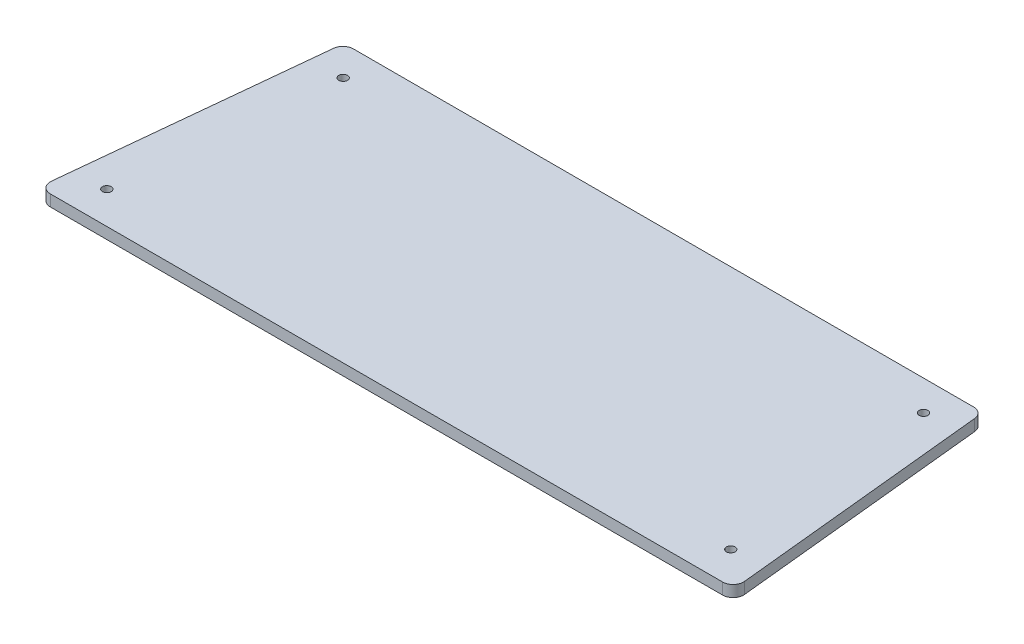
ISO-10303-21;
HEADER;
FILE_DESCRIPTION(('STEP AP214'),'2;1');
FILE_NAME('part.step','',(''),(''),'','','');
FILE_SCHEMA(('AUTOMOTIVE_DESIGN { 1 0 10303 214 1 1 1 1 }'));
ENDSEC;
DATA;
#1=APPLICATION_CONTEXT('core data for automotive mechanical design processes');
#2=APPLICATION_PROTOCOL_DEFINITION('international standard','automotive_design',2000,#1);
#3=PRODUCT_CONTEXT('',#1,'mechanical');
#4=PRODUCT('Part','Part','',(#3));
#5=PRODUCT_RELATED_PRODUCT_CATEGORY('part','',(#4));
#6=PRODUCT_DEFINITION_FORMATION('','',#4);
#7=PRODUCT_DEFINITION_CONTEXT('part definition',#1,'design');
#8=PRODUCT_DEFINITION('design','',#6,#7);
#9=PRODUCT_DEFINITION_SHAPE('','',#8);
#10=(LENGTH_UNIT() NAMED_UNIT(*) SI_UNIT(.MILLI.,.METRE.));
#11=(NAMED_UNIT(*) PLANE_ANGLE_UNIT() SI_UNIT($,.RADIAN.));
#12=(NAMED_UNIT(*) SI_UNIT($,.STERADIAN.) SOLID_ANGLE_UNIT());
#13=UNCERTAINTY_MEASURE_WITH_UNIT(LENGTH_MEASURE(1.E-05),#10,'distance_accuracy_value','');
#14=(GEOMETRIC_REPRESENTATION_CONTEXT(3) GLOBAL_UNCERTAINTY_ASSIGNED_CONTEXT((#13)) GLOBAL_UNIT_ASSIGNED_CONTEXT((#10,
#11,#12)) REPRESENTATION_CONTEXT('',''));
#15=CARTESIAN_POINT('',(0.,0.,0.));
#16=DIRECTION('',(0.,0.,1.));
#17=DIRECTION('',(1.,0.,0.));
#18=AXIS2_PLACEMENT_3D('',#15,#16,#17);
#19=CARTESIAN_POINT('',(-71.4111768121629,103.49103575224,59.4433756729741));
#20=DIRECTION('',(0.,-1.,0.));
#21=DIRECTION('',(0.,0.,-1.));
#22=AXIS2_PLACEMENT_3D('',#19,#20,#21);
#23=CYLINDRICAL_SURFACE('',#22,0.999999999999998);
#24=CARTESIAN_POINT('',(-71.4111768121629,-9.40000000000001,59.4433756729741));
#25=DIRECTION('',(0.,-1.,0.));
#26=DIRECTION('',(0.,0.,-1.));
#27=AXIS2_PLACEMENT_3D('',#24,#25,#26);
#28=CIRCLE('',#27,0.999999999999998);
#29=CARTESIAN_POINT('',(-71.4111768121629,-9.40000000000001,58.4433756729741));
#30=VERTEX_POINT('',#29);
#31=EDGE_CURVE('E155',#30,#30,#28,.F.);
#32=CARTESIAN_POINT('',(-71.4111768121629,-10.8,59.4433756729741));
#33=DIRECTION('',(0.,-1.,0.));
#34=DIRECTION('',(0.,0.,-1.));
#35=AXIS2_PLACEMENT_3D('',#32,#33,#34);
#36=CIRCLE('',#35,0.999999999999998);
#37=CARTESIAN_POINT('',(-71.4111768121629,-10.8,58.4433756729741));
#38=VERTEX_POINT('',#37);
#39=EDGE_CURVE('E165',#38,#38,#36,.F.);
#40=CARTESIAN_POINT('',(-71.4111768121629,-9.40000000000001,58.4433756729741));
#41=CARTESIAN_POINT('',(-71.4111768121629,-9.41458333333334,58.4433756729741));
#42=CARTESIAN_POINT('',(-71.4111768121629,-9.42916666666667,58.4433756729741));
#43=CARTESIAN_POINT('',(-71.4111768121629,-9.45833333333334,58.4433756729741));
#44=CARTESIAN_POINT('',(-71.4111768121629,-9.47291666666667,58.4433756729741));
#45=CARTESIAN_POINT('',(-71.4111768121629,-9.50208333333334,58.4433756729741));
#46=CARTESIAN_POINT('',(-71.4111768121629,-9.51666666666667,58.4433756729741));
#47=CARTESIAN_POINT('',(-71.4111768121629,-9.54583333333334,58.4433756729741));
#48=CARTESIAN_POINT('',(-71.4111768121629,-9.56041666666667,58.4433756729741));
#49=CARTESIAN_POINT('',(-71.4111768121629,-9.58958333333334,58.4433756729741));
#50=CARTESIAN_POINT('',(-71.4111768121629,-9.60416666666667,58.4433756729741));
#51=CARTESIAN_POINT('',(-71.4111768121629,-9.63333333333334,58.4433756729741));
#52=CARTESIAN_POINT('',(-71.4111768121629,-9.64791666666667,58.4433756729741));
#53=CARTESIAN_POINT('',(-71.4111768121629,-9.67708333333334,58.4433756729741));
#54=CARTESIAN_POINT('',(-71.4111768121629,-9.69166666666667,58.4433756729741));
#55=CARTESIAN_POINT('',(-71.4111768121629,-9.72083333333333,58.4433756729741));
#56=CARTESIAN_POINT('',(-71.4111768121629,-9.73541666666666,58.4433756729741));
#57=CARTESIAN_POINT('',(-71.4111768121629,-9.76458333333333,58.4433756729741));
#58=CARTESIAN_POINT('',(-71.4111768121629,-9.77916666666667,58.4433756729741));
#59=CARTESIAN_POINT('',(-71.4111768121629,-9.80833333333334,58.4433756729741));
#60=CARTESIAN_POINT('',(-71.4111768121629,-9.82291666666667,58.4433756729741));
#61=CARTESIAN_POINT('',(-71.4111768121629,-9.85208333333333,58.4433756729741));
#62=CARTESIAN_POINT('',(-71.4111768121629,-9.86666666666666,58.4433756729741));
#63=CARTESIAN_POINT('',(-71.4111768121629,-9.89583333333333,58.4433756729741));
#64=CARTESIAN_POINT('',(-71.4111768121629,-9.91041666666667,58.4433756729741));
#65=CARTESIAN_POINT('',(-71.4111768121629,-9.93958333333333,58.4433756729741));
#66=CARTESIAN_POINT('',(-71.4111768121629,-9.95416666666667,58.4433756729741));
#67=CARTESIAN_POINT('',(-71.4111768121629,-9.98333333333333,58.4433756729741));
#68=CARTESIAN_POINT('',(-71.4111768121629,-9.99791666666666,58.4433756729741));
#69=CARTESIAN_POINT('',(-71.4111768121629,-10.0270833333333,58.4433756729741));
#70=CARTESIAN_POINT('',(-71.4111768121629,-10.0416666666667,58.4433756729741));
#71=CARTESIAN_POINT('',(-71.4111768121629,-10.0708333333333,58.4433756729741));
#72=CARTESIAN_POINT('',(-71.4111768121629,-10.0854166666667,58.4433756729741));
#73=CARTESIAN_POINT('',(-71.4111768121629,-10.1145833333333,58.4433756729741));
#74=CARTESIAN_POINT('',(-71.4111768121629,-10.1291666666667,58.4433756729741));
#75=CARTESIAN_POINT('',(-71.4111768121629,-10.1583333333333,58.4433756729741));
#76=CARTESIAN_POINT('',(-71.4111768121629,-10.1729166666667,58.4433756729741));
#77=CARTESIAN_POINT('',(-71.4111768121629,-10.2020833333333,58.4433756729741));
#78=CARTESIAN_POINT('',(-71.4111768121629,-10.2166666666667,58.4433756729741));
#79=CARTESIAN_POINT('',(-71.4111768121629,-10.2458333333333,58.4433756729741));
#80=CARTESIAN_POINT('',(-71.4111768121629,-10.2604166666667,58.4433756729741));
#81=CARTESIAN_POINT('',(-71.4111768121629,-10.2895833333333,58.4433756729741));
#82=CARTESIAN_POINT('',(-71.4111768121629,-10.3041666666667,58.4433756729741));
#83=CARTESIAN_POINT('',(-71.4111768121629,-10.3333333333333,58.4433756729741));
#84=CARTESIAN_POINT('',(-71.4111768121629,-10.3479166666667,58.4433756729741));
#85=CARTESIAN_POINT('',(-71.4111768121629,-10.3770833333333,58.4433756729741));
#86=CARTESIAN_POINT('',(-71.4111768121629,-10.3916666666667,58.4433756729741));
#87=CARTESIAN_POINT('',(-71.4111768121629,-10.4208333333333,58.4433756729741));
#88=CARTESIAN_POINT('',(-71.4111768121629,-10.4354166666667,58.4433756729741));
#89=CARTESIAN_POINT('',(-71.4111768121629,-10.4645833333333,58.4433756729741));
#90=CARTESIAN_POINT('',(-71.4111768121629,-10.4791666666667,58.4433756729741));
#91=CARTESIAN_POINT('',(-71.4111768121629,-10.5083333333333,58.4433756729741));
#92=CARTESIAN_POINT('',(-71.4111768121629,-10.5229166666667,58.4433756729741));
#93=CARTESIAN_POINT('',(-71.4111768121629,-10.5520833333333,58.4433756729741));
#94=CARTESIAN_POINT('',(-71.4111768121629,-10.5666666666667,58.4433756729741));
#95=CARTESIAN_POINT('',(-71.4111768121629,-10.5958333333333,58.4433756729741));
#96=CARTESIAN_POINT('',(-71.4111768121629,-10.6104166666667,58.4433756729741));
#97=CARTESIAN_POINT('',(-71.4111768121629,-10.6395833333333,58.4433756729741));
#98=CARTESIAN_POINT('',(-71.4111768121629,-10.6541666666667,58.4433756729741));
#99=CARTESIAN_POINT('',(-71.4111768121629,-10.6833333333333,58.4433756729741));
#100=CARTESIAN_POINT('',(-71.4111768121629,-10.6979166666667,58.4433756729741));
#101=CARTESIAN_POINT('',(-71.4111768121629,-10.7270833333333,58.4433756729741));
#102=CARTESIAN_POINT('',(-71.4111768121629,-10.7416666666667,58.4433756729741));
#103=CARTESIAN_POINT('',(-71.4111768121629,-10.7708333333333,58.4433756729741));
#104=CARTESIAN_POINT('',(-71.4111768121629,-10.7854166666667,58.4433756729741));
#105=CARTESIAN_POINT('',(-71.4111768121629,-10.8,58.4433756729741));
#106=B_SPLINE_CURVE_WITH_KNOTS('',3,(#40,#41,#42,#43,#44,#45,#46,#47,#48,#49,#50,#51,#52,#53,
#54,#55,#56,#57,#58,#59,#60,#61,#62,#63,#64,#65,#66,#67,#68,#69,#70,#71,#72,#73,#74,#75,#76,#77,
#78,#79,#80,#81,#82,#83,#84,#85,#86,#87,#88,#89,#90,#91,#92,#93,#94,#95,#96,#97,#98,#99,#100,
#101,#102,#103,#104,#105),.UNSPECIFIED.,.F.,.F.,(4,2,2,2,2,2,2,2,2,2,2,2,2,2,2,2,2,2,2,2,2,2,2,
2,2,2,2,2,2,2,2,2,4),(0.,0.0437499999999952,0.0875000000000042,0.131249999999999,
0.174999999999995,0.218750000000004,0.262499999999999,0.306249999999994,0.349999999999989,
0.393749999999998,0.437499999999993,0.481249999999989,0.524999999999998,0.568749999999993,
0.612499999999988,0.656249999999997,0.699999999999992,0.743749999999987,0.787499999999997,
0.831249999999992,0.874999999999987,0.918749999999996,0.962499999999991,1.00624999999999,1.05,
1.09374999999999,1.13749999999999,1.18124999999998,1.22499999999999,1.26874999999999,
1.31249999999998,1.35624999999999,1.39999999999998),.UNSPECIFIED.);
#107=EDGE_CURVE('BSEAM33',#30,#38,#106,.T.);
#108=ORIENTED_EDGE('',*,*,#31,.T.);
#109=ORIENTED_EDGE('',*,*,#39,.F.);
#110=ORIENTED_EDGE('',*,*,#107,.T.);
#111=ORIENTED_EDGE('',*,*,#107,.F.);
#112=EDGE_LOOP('',(#108,#110,#109,#111));
#113=FACE_BOUND('',#112,.T.);
#114=ADVANCED_FACE('F33',(#113),#23,.F.);
#115=CARTESIAN_POINT('',(-66.4225035700687,103.49103575224,10.330802685809));
#116=DIRECTION('',(0.,-1.,0.));
#117=DIRECTION('',(0.,0.,-1.));
#118=AXIS2_PLACEMENT_3D('',#115,#116,#117);
#119=CYLINDRICAL_SURFACE('',#118,0.999999999999998);
#120=CARTESIAN_POINT('',(-66.4225035700687,-9.40000000000001,10.330802685809));
#121=DIRECTION('',(0.,-1.,0.));
#122=DIRECTION('',(0.,0.,-1.));
#123=AXIS2_PLACEMENT_3D('',#120,#121,#122);
#124=CIRCLE('',#123,0.999999999999998);
#125=CARTESIAN_POINT('',(-66.4225035700687,-9.39999999999999,9.33080268580897));
#126=VERTEX_POINT('',#125);
#127=EDGE_CURVE('E195',#126,#126,#124,.F.);
#128=CARTESIAN_POINT('',(-66.4225035700687,-10.8,10.330802685809));
#129=DIRECTION('',(0.,-1.,0.));
#130=DIRECTION('',(0.,0.,-1.));
#131=AXIS2_PLACEMENT_3D('',#128,#129,#130);
#132=CIRCLE('',#131,0.999999999999998);
#133=CARTESIAN_POINT('',(-66.4225035700687,-10.8,9.33080268580897));
#134=VERTEX_POINT('',#133);
#135=EDGE_CURVE('E156',#134,#134,#132,.F.);
#136=CARTESIAN_POINT('',(-66.4225035700687,-9.39999999999999,9.33080268580897));
#137=CARTESIAN_POINT('',(-66.4225035700687,-9.41458333333332,9.33080268580897));
#138=CARTESIAN_POINT('',(-66.4225035700687,-9.42916666666665,9.33080268580897));
#139=CARTESIAN_POINT('',(-66.4225035700687,-9.45833333333332,9.33080268580897));
#140=CARTESIAN_POINT('',(-66.4225035700687,-9.47291666666666,9.33080268580897));
#141=CARTESIAN_POINT('',(-66.4225035700687,-9.50208333333333,9.33080268580897));
#142=CARTESIAN_POINT('',(-66.4225035700687,-9.51666666666666,9.33080268580897));
#143=CARTESIAN_POINT('',(-66.4225035700687,-9.54583333333333,9.33080268580897));
#144=CARTESIAN_POINT('',(-66.4225035700687,-9.56041666666666,9.33080268580897));
#145=CARTESIAN_POINT('',(-66.4225035700687,-9.58958333333333,9.33080268580897));
#146=CARTESIAN_POINT('',(-66.4225035700687,-9.60416666666666,9.33080268580897));
#147=CARTESIAN_POINT('',(-66.4225035700687,-9.63333333333333,9.33080268580897));
#148=CARTESIAN_POINT('',(-66.4225035700687,-9.64791666666666,9.33080268580897));
#149=CARTESIAN_POINT('',(-66.4225035700687,-9.67708333333333,9.33080268580897));
#150=CARTESIAN_POINT('',(-66.4225035700687,-9.69166666666666,9.33080268580897));
#151=CARTESIAN_POINT('',(-66.4225035700687,-9.72083333333333,9.33080268580897));
#152=CARTESIAN_POINT('',(-66.4225035700687,-9.73541666666666,9.33080268580897));
#153=CARTESIAN_POINT('',(-66.4225035700687,-9.76458333333333,9.33080268580897));
#154=CARTESIAN_POINT('',(-66.4225035700687,-9.77916666666666,9.33080268580897));
#155=CARTESIAN_POINT('',(-66.4225035700687,-9.80833333333333,9.33080268580897));
#156=CARTESIAN_POINT('',(-66.4225035700687,-9.82291666666666,9.33080268580897));
#157=CARTESIAN_POINT('',(-66.4225035700687,-9.85208333333333,9.33080268580897));
#158=CARTESIAN_POINT('',(-66.4225035700687,-9.86666666666666,9.33080268580897));
#159=CARTESIAN_POINT('',(-66.4225035700687,-9.89583333333333,9.33080268580897));
#160=CARTESIAN_POINT('',(-66.4225035700687,-9.91041666666666,9.33080268580897));
#161=CARTESIAN_POINT('',(-66.4225035700687,-9.93958333333333,9.33080268580897));
#162=CARTESIAN_POINT('',(-66.4225035700687,-9.95416666666666,9.33080268580897));
#163=CARTESIAN_POINT('',(-66.4225035700687,-9.98333333333333,9.33080268580897));
#164=CARTESIAN_POINT('',(-66.4225035700687,-9.99791666666666,9.33080268580897));
#165=CARTESIAN_POINT('',(-66.4225035700687,-10.0270833333333,9.33080268580897));
#166=CARTESIAN_POINT('',(-66.4225035700687,-10.0416666666667,9.33080268580897));
#167=CARTESIAN_POINT('',(-66.4225035700687,-10.0708333333333,9.33080268580897));
#168=CARTESIAN_POINT('',(-66.4225035700687,-10.0854166666667,9.33080268580897));
#169=CARTESIAN_POINT('',(-66.4225035700687,-10.1145833333333,9.33080268580897));
#170=CARTESIAN_POINT('',(-66.4225035700687,-10.1291666666667,9.33080268580897));
#171=CARTESIAN_POINT('',(-66.4225035700687,-10.1583333333333,9.33080268580897));
#172=CARTESIAN_POINT('',(-66.4225035700687,-10.1729166666667,9.33080268580897));
#173=CARTESIAN_POINT('',(-66.4225035700687,-10.2020833333333,9.33080268580897));
#174=CARTESIAN_POINT('',(-66.4225035700687,-10.2166666666667,9.33080268580897));
#175=CARTESIAN_POINT('',(-66.4225035700687,-10.2458333333333,9.33080268580897));
#176=CARTESIAN_POINT('',(-66.4225035700687,-10.2604166666667,9.33080268580897));
#177=CARTESIAN_POINT('',(-66.4225035700687,-10.2895833333333,9.33080268580897));
#178=CARTESIAN_POINT('',(-66.4225035700687,-10.3041666666667,9.33080268580897));
#179=CARTESIAN_POINT('',(-66.4225035700687,-10.3333333333333,9.33080268580897));
#180=CARTESIAN_POINT('',(-66.4225035700687,-10.3479166666667,9.33080268580897));
#181=CARTESIAN_POINT('',(-66.4225035700687,-10.3770833333333,9.33080268580897));
#182=CARTESIAN_POINT('',(-66.4225035700687,-10.3916666666667,9.33080268580897));
#183=CARTESIAN_POINT('',(-66.4225035700687,-10.4208333333333,9.33080268580897));
#184=CARTESIAN_POINT('',(-66.4225035700687,-10.4354166666667,9.33080268580897));
#185=CARTESIAN_POINT('',(-66.4225035700687,-10.4645833333333,9.33080268580897));
#186=CARTESIAN_POINT('',(-66.4225035700687,-10.4791666666667,9.33080268580897));
#187=CARTESIAN_POINT('',(-66.4225035700687,-10.5083333333333,9.33080268580897));
#188=CARTESIAN_POINT('',(-66.4225035700687,-10.5229166666667,9.33080268580897));
#189=CARTESIAN_POINT('',(-66.4225035700687,-10.5520833333333,9.33080268580897));
#190=CARTESIAN_POINT('',(-66.4225035700687,-10.5666666666667,9.33080268580897));
#191=CARTESIAN_POINT('',(-66.4225035700687,-10.5958333333333,9.33080268580897));
#192=CARTESIAN_POINT('',(-66.4225035700687,-10.6104166666667,9.33080268580897));
#193=CARTESIAN_POINT('',(-66.4225035700687,-10.6395833333333,9.33080268580897));
#194=CARTESIAN_POINT('',(-66.4225035700687,-10.6541666666667,9.33080268580897));
#195=CARTESIAN_POINT('',(-66.4225035700687,-10.6833333333333,9.33080268580897));
#196=CARTESIAN_POINT('',(-66.4225035700687,-10.6979166666667,9.33080268580897));
#197=CARTESIAN_POINT('',(-66.4225035700687,-10.7270833333333,9.33080268580897));
#198=CARTESIAN_POINT('',(-66.4225035700687,-10.7416666666667,9.33080268580897));
#199=CARTESIAN_POINT('',(-66.4225035700687,-10.7708333333333,9.33080268580897));
#200=CARTESIAN_POINT('',(-66.4225035700687,-10.7854166666667,9.33080268580897));
#201=CARTESIAN_POINT('',(-66.4225035700687,-10.8,9.33080268580897));
#202=B_SPLINE_CURVE_WITH_KNOTS('',3,(#136,#137,#138,#139,#140,#141,#142,#143,#144,#145,#146,
#147,#148,#149,#150,#151,#152,#153,#154,#155,#156,#157,#158,#159,#160,#161,#162,#163,#164,#165,
#166,#167,#168,#169,#170,#171,#172,#173,#174,#175,#176,#177,#178,#179,#180,#181,#182,#183,#184,
#185,#186,#187,#188,#189,#190,#191,#192,#193,#194,#195,#196,#197,#198,#199,#200,#201),
.UNSPECIFIED.,.F.,.F.,(4,2,2,2,2,2,2,2,2,2,2,2,2,2,2,2,2,2,2,2,2,2,2,2,2,2,2,2,2,2,2,2,4),(0.,
0.0437499999999952,0.0875000000000042,0.131249999999999,0.175000000000008,0.218750000000004,
0.262499999999999,0.306250000000008,0.350000000000003,0.393749999999998,0.437500000000007,
0.481250000000003,0.524999999999998,0.568750000000007,0.612500000000002,0.656250000000011,
0.700000000000006,0.743750000000001,0.78750000000001,0.831250000000006,0.875000000000015,
0.91875000000001,0.962500000000005,1.00625000000001,1.05000000000001,1.09375,1.13750000000001,
1.18125000000001,1.225,1.26875000000001,1.31250000000001,1.35625000000002,1.40000000000001),.UNSPECIFIED.);
#203=EDGE_CURVE('BSEAM231',#126,#134,#202,.T.);
#204=ORIENTED_EDGE('',*,*,#127,.T.);
#205=ORIENTED_EDGE('',*,*,#135,.F.);
#206=ORIENTED_EDGE('',*,*,#203,.T.);
#207=ORIENTED_EDGE('',*,*,#203,.F.);
#208=EDGE_LOOP('',(#204,#206,#205,#207));
#209=FACE_BOUND('',#208,.T.);
#210=ADVANCED_FACE('F231',(#209),#119,.F.);
#211=CARTESIAN_POINT('',(76.9447864570778,-182.895859719511,64.443375672974));
#212=DIRECTION('',(0.,1.,0.));
#213=DIRECTION('',(0.,0.,1.));
#214=AXIS2_PLACEMENT_3D('',#211,#212,#213);
#215=CYLINDRICAL_SURFACE('',#214,2.4);
#216=CARTESIAN_POINT('',(76.9447864570778,-12.,64.4433756729741));
#217=DIRECTION('',(0.,-1.,0.));
#218=DIRECTION('',(0.,0.,-1.));
#219=AXIS2_PLACEMENT_3D('',#216,#217,#218);
#220=CIRCLE('',#219,2.4);
#221=CARTESIAN_POINT('',(79.3325001582669,-12.,64.2008405597351));
#222=VERTEX_POINT('',#221);
#223=CARTESIAN_POINT('',(76.9447864570778,-12.,66.8433756729741));
#224=VERTEX_POINT('',#223);
#225=EDGE_CURVE('E133',#222,#224,#220,.T.);
#226=ORIENTED_EDGE('',*,*,#225,.F.);
#227=DIRECTION('',(0.,1.,0.));
#228=VECTOR('',#227,1.);
#229=CARTESIAN_POINT('',(79.3325001582669,-182.895859719511,64.200840559735));
#230=LINE('',#229,#228);
#231=CARTESIAN_POINT('',(79.3325001582669,-9.40000000000001,64.200840559735));
#232=VERTEX_POINT('',#231);
#233=EDGE_CURVE('E50',#222,#232,#230,.T.);
#234=ORIENTED_EDGE('',*,*,#233,.T.);
#235=CARTESIAN_POINT('',(76.9447864570778,-9.40000000000001,64.4433756729741));
#236=DIRECTION('',(0.,-1.,0.));
#237=DIRECTION('',(0.,0.,-1.));
#238=AXIS2_PLACEMENT_3D('',#235,#236,#237);
#239=CIRCLE('',#238,2.4);
#240=CARTESIAN_POINT('',(76.9447864570778,-9.40000000000001,66.8433756729741));
#241=VERTEX_POINT('',#240);
#242=EDGE_CURVE('E141',#232,#241,#239,.T.);
#243=ORIENTED_EDGE('',*,*,#242,.T.);
#244=DIRECTION('',(0.,1.,0.));
#245=VECTOR('',#244,1.);
#246=CARTESIAN_POINT('',(76.9447864570778,-182.895859719511,66.843375672974));
#247=LINE('',#246,#245);
#248=EDGE_CURVE('E89',#224,#241,#247,.T.);
#249=ORIENTED_EDGE('',*,*,#248,.F.);
#250=EDGE_LOOP('',(#226,#234,#243,#249));
#251=FACE_BOUND('',#250,.T.);
#252=ADVANCED_FACE('F212',(#251),#215,.T.);
#253=CARTESIAN_POINT('',(76.9447864570778,-182.895859719511,66.843375672974));
#254=DIRECTION('',(0.,0.,-1.));
#255=DIRECTION('',(0.,1.,0.));
#256=AXIS2_PLACEMENT_3D('',#253,#254,#255);
#257=PLANE('',#256);
#258=DIRECTION('',(-1.,0.,0.));
#259=VECTOR('',#258,1.);
#260=CARTESIAN_POINT('',(76.9447864570778,-12.,66.8433756729741));
#261=LINE('',#260,#259);
#262=CARTESIAN_POINT('',(-76.9447864570778,-12.,66.8433756729741));
#263=VERTEX_POINT('',#262);
#264=EDGE_CURVE('E96',#224,#263,#261,.T.);
#265=ORIENTED_EDGE('',*,*,#264,.F.);
#266=ORIENTED_EDGE('',*,*,#248,.T.);
#267=DIRECTION('',(-1.,0.,0.));
#268=VECTOR('',#267,1.);
#269=CARTESIAN_POINT('',(76.9447864570778,-9.40000000000001,66.8433756729741));
#270=LINE('',#269,#268);
#271=CARTESIAN_POINT('',(-76.9447864570778,-9.40000000000001,66.8433756729741));
#272=VERTEX_POINT('',#271);
#273=EDGE_CURVE('E140',#241,#272,#270,.T.);
#274=ORIENTED_EDGE('',*,*,#273,.T.);
#275=DIRECTION('',(0.,1.,0.));
#276=VECTOR('',#275,1.);
#277=CARTESIAN_POINT('',(-76.9447864570778,-182.895859719511,66.8433756729741));
#278=LINE('',#277,#276);
#279=EDGE_CURVE('E142',#263,#272,#278,.T.);
#280=ORIENTED_EDGE('',*,*,#279,.F.);
#281=EDGE_LOOP('',(#265,#266,#274,#280));
#282=FACE_BOUND('',#281,.T.);
#283=ADVANCED_FACE('F218',(#282),#257,.F.);
#284=CARTESIAN_POINT('',(-76.9447864570778,-182.895859719511,64.443375672974));
#285=DIRECTION('',(0.,1.,0.));
#286=DIRECTION('',(0.,0.,1.));
#287=AXIS2_PLACEMENT_3D('',#284,#285,#286);
#288=CYLINDRICAL_SURFACE('',#287,2.40000000000001);
#289=CARTESIAN_POINT('',(-76.9447864570778,-12.,64.4433756729741));
#290=DIRECTION('',(0.,-1.,0.));
#291=DIRECTION('',(0.,0.,-1.));
#292=AXIS2_PLACEMENT_3D('',#289,#290,#291);
#293=CIRCLE('',#292,2.40000000000001);
#294=CARTESIAN_POINT('',(-79.3325001582669,-12.,64.200840559735));
#295=VERTEX_POINT('',#294);
#296=EDGE_CURVE('E129',#263,#295,#293,.T.);
#297=ORIENTED_EDGE('',*,*,#296,.F.);
#298=ORIENTED_EDGE('',*,*,#279,.T.);
#299=CARTESIAN_POINT('',(-76.9447864570778,-9.40000000000001,64.4433756729741));
#300=DIRECTION('',(0.,-1.,0.));
#301=DIRECTION('',(0.,0.,-1.));
#302=AXIS2_PLACEMENT_3D('',#299,#300,#301);
#303=CIRCLE('',#302,2.40000000000001);
#304=CARTESIAN_POINT('',(-79.3325001582669,-9.40000000000001,64.200840559735));
#305=VERTEX_POINT('',#304);
#306=EDGE_CURVE('E144',#272,#305,#303,.T.);
#307=ORIENTED_EDGE('',*,*,#306,.T.);
#308=DIRECTION('',(0.,1.,0.));
#309=VECTOR('',#308,1.);
#310=CARTESIAN_POINT('',(-79.3325001582669,-182.895859719511,64.200840559735));
#311=LINE('',#310,#309);
#312=EDGE_CURVE('E145',#295,#305,#311,.T.);
#313=ORIENTED_EDGE('',*,*,#312,.F.);
#314=EDGE_LOOP('',(#297,#298,#307,#313));
#315=FACE_BOUND('',#314,.T.);
#316=ADVANCED_FACE('F384',(#315),#288,.T.);
#317=CARTESIAN_POINT('',(-79.3325001582669,-182.895859719511,64.200840559735));
#318=DIRECTION('',(0.994880708828789,0.,0.101056297182943));
#319=DIRECTION('',(0.101056297182943,0.,-0.994880708828789));
#320=AXIS2_PLACEMENT_3D('',#317,#318,#319);
#321=PLANE('',#320);
#322=DIRECTION('',(0.101056297182943,0.,-0.994880708828789));
#323=VECTOR('',#322,1.);
#324=CARTESIAN_POINT('',(-79.3325001582669,-12.,64.200840559735));
#325=LINE('',#324,#323);
#326=CARTESIAN_POINT('',(-73.3773626505464,-12.,5.57360415774763));
#327=VERTEX_POINT('',#326);
#328=EDGE_CURVE('E124',#295,#327,#325,.T.);
#329=ORIENTED_EDGE('',*,*,#328,.F.);
#330=ORIENTED_EDGE('',*,*,#312,.T.);
#331=DIRECTION('',(0.101056297182943,0.,-0.994880708828789));
#332=VECTOR('',#331,1.);
#333=CARTESIAN_POINT('',(-79.3325001582669,-9.40000000000001,64.200840559735));
#334=LINE('',#333,#332);
#335=CARTESIAN_POINT('',(-73.3773626505464,-9.4,5.57360415774763));
#336=VERTEX_POINT('',#335);
#337=EDGE_CURVE('E147',#305,#336,#334,.T.);
#338=ORIENTED_EDGE('',*,*,#337,.T.);
#339=DIRECTION('',(0.,1.,0.));
#340=VECTOR('',#339,1.);
#341=CARTESIAN_POINT('',(-73.3773626505464,-182.895859719511,5.57360415774761));
#342=LINE('',#341,#340);
#343=EDGE_CURVE('E148',#327,#336,#342,.T.);
#344=ORIENTED_EDGE('',*,*,#343,.F.);
#345=EDGE_LOOP('',(#329,#330,#338,#344));
#346=FACE_BOUND('',#345,.T.);
#347=ADVANCED_FACE('F375',(#346),#321,.F.);
#348=CARTESIAN_POINT('',(-70.9896489493573,-182.895859719511,5.81613927098671));
#349=DIRECTION('',(0.,1.,0.));
#350=DIRECTION('',(0.,0.,1.));
#351=AXIS2_PLACEMENT_3D('',#348,#349,#350);
#352=CYLINDRICAL_SURFACE('',#351,2.39999999999999);
#353=CARTESIAN_POINT('',(-70.9896489493573,-12.,5.81613927098673));
#354=DIRECTION('',(0.,-1.,0.));
#355=DIRECTION('',(0.,0.,-1.));
#356=AXIS2_PLACEMENT_3D('',#353,#354,#355);
#357=CIRCLE('',#356,2.39999999999999);
#358=CARTESIAN_POINT('',(-70.9896489493573,-12.,3.41613927098675));
#359=VERTEX_POINT('',#358);
#360=EDGE_CURVE('E122',#327,#359,#357,.T.);
#361=ORIENTED_EDGE('',*,*,#360,.F.);
#362=ORIENTED_EDGE('',*,*,#343,.T.);
#363=CARTESIAN_POINT('',(-70.9896489493573,-9.4,5.81613927098673));
#364=DIRECTION('',(0.,-1.,0.));
#365=DIRECTION('',(0.,0.,-1.));
#366=AXIS2_PLACEMENT_3D('',#363,#364,#365);
#367=CIRCLE('',#366,2.39999999999999);
#368=CARTESIAN_POINT('',(-70.9896489493573,-9.4,3.41613927098675));
#369=VERTEX_POINT('',#368);
#370=EDGE_CURVE('E150',#336,#369,#367,.T.);
#371=ORIENTED_EDGE('',*,*,#370,.T.);
#372=DIRECTION('',(0.,1.,0.));
#373=VECTOR('',#372,1.);
#374=CARTESIAN_POINT('',(-70.9896489493573,-182.895859719511,3.41613927098672));
#375=LINE('',#374,#373);
#376=EDGE_CURVE('E151',#359,#369,#375,.T.);
#377=ORIENTED_EDGE('',*,*,#376,.F.);
#378=EDGE_LOOP('',(#361,#362,#371,#377));
#379=FACE_BOUND('',#378,.T.);
#380=ADVANCED_FACE('F366',(#379),#352,.T.);
#381=CARTESIAN_POINT('',(-70.9896489493573,-182.895859719511,3.41613927098672));
#382=DIRECTION('',(0.,0.,1.));
#383=DIRECTION('',(1.,0.,0.));
#384=AXIS2_PLACEMENT_3D('',#381,#382,#383);
#385=PLANE('',#384);
#386=DIRECTION('',(1.,0.,0.));
#387=VECTOR('',#386,1.);
#388=CARTESIAN_POINT('',(-70.9896489493573,-12.,3.41613927098675));
#389=LINE('',#388,#387);
#390=CARTESIAN_POINT('',(70.9896489493573,-12.,3.41613927098671));
#391=VERTEX_POINT('',#390);
#392=EDGE_CURVE('E42',#359,#391,#389,.T.);
#393=ORIENTED_EDGE('',*,*,#392,.F.);
#394=ORIENTED_EDGE('',*,*,#376,.T.);
#395=DIRECTION('',(1.,0.,0.));
#396=VECTOR('',#395,1.);
#397=CARTESIAN_POINT('',(-70.9896489493573,-9.4,3.41613927098675));
#398=LINE('',#397,#396);
#399=CARTESIAN_POINT('',(70.9896489493573,-9.4,3.41613927098671));
#400=VERTEX_POINT('',#399);
#401=EDGE_CURVE('E116',#369,#400,#398,.T.);
#402=ORIENTED_EDGE('',*,*,#401,.T.);
#403=DIRECTION('',(0.,1.,0.));
#404=VECTOR('',#403,1.);
#405=CARTESIAN_POINT('',(70.9896489493573,-182.895859719511,3.41613927098669));
#406=LINE('',#405,#404);
#407=EDGE_CURVE('E107',#391,#400,#406,.T.);
#408=ORIENTED_EDGE('',*,*,#407,.F.);
#409=EDGE_LOOP('',(#393,#394,#402,#408));
#410=FACE_BOUND('',#409,.T.);
#411=ADVANCED_FACE('F113',(#410),#385,.F.);
#412=CARTESIAN_POINT('',(70.9896489493573,-182.895859719511,5.81613927098669));
#413=DIRECTION('',(0.,1.,0.));
#414=DIRECTION('',(0.,0.,1.));
#415=AXIS2_PLACEMENT_3D('',#412,#413,#414);
#416=CYLINDRICAL_SURFACE('',#415,2.4);
#417=CARTESIAN_POINT('',(70.9896489493573,-12.,5.81613927098671));
#418=DIRECTION('',(0.,-1.,0.));
#419=DIRECTION('',(0.,0.,-1.));
#420=AXIS2_PLACEMENT_3D('',#417,#418,#419);
#421=CIRCLE('',#420,2.4);
#422=CARTESIAN_POINT('',(73.3773626505464,-12.,5.57360415774766));
#423=VERTEX_POINT('',#422);
#424=EDGE_CURVE('E11',#391,#423,#421,.T.);
#425=ORIENTED_EDGE('',*,*,#424,.F.);
#426=ORIENTED_EDGE('',*,*,#407,.T.);
#427=CARTESIAN_POINT('',(70.9896489493573,-9.4,5.81613927098671));
#428=DIRECTION('',(0.,-1.,0.));
#429=DIRECTION('',(0.,0.,-1.));
#430=AXIS2_PLACEMENT_3D('',#427,#428,#429);
#431=CIRCLE('',#430,2.4);
#432=CARTESIAN_POINT('',(73.3773626505464,-9.4,5.57360415774766));
#433=VERTEX_POINT('',#432);
#434=EDGE_CURVE('E118',#400,#433,#431,.T.);
#435=ORIENTED_EDGE('',*,*,#434,.T.);
#436=DIRECTION('',(0.,1.,0.));
#437=VECTOR('',#436,1.);
#438=CARTESIAN_POINT('',(73.3773626505464,-182.895859719511,5.57360415774764));
#439=LINE('',#438,#437);
#440=EDGE_CURVE('E56',#423,#433,#439,.T.);
#441=ORIENTED_EDGE('',*,*,#440,.F.);
#442=EDGE_LOOP('',(#425,#426,#435,#441));
#443=FACE_BOUND('',#442,.T.);
#444=ADVANCED_FACE('F106',(#443),#416,.T.);
#445=CARTESIAN_POINT('',(73.3773626505464,-182.895859719511,5.57360415774764));
#446=DIRECTION('',(-0.994880708828789,0.,0.101056297182943));
#447=DIRECTION('',(0.101056297182943,0.,0.994880708828789));
#448=AXIS2_PLACEMENT_3D('',#445,#446,#447);
#449=PLANE('',#448);
#450=DIRECTION('',(0.101056297182943,0.,0.994880708828789));
#451=VECTOR('',#450,1.);
#452=CARTESIAN_POINT('',(73.3773626505464,-12.,5.57360415774766));
#453=LINE('',#452,#451);
#454=EDGE_CURVE('E136',#423,#222,#453,.T.);
#455=ORIENTED_EDGE('',*,*,#454,.F.);
#456=ORIENTED_EDGE('',*,*,#440,.T.);
#457=DIRECTION('',(0.101056297182943,0.,0.994880708828789));
#458=VECTOR('',#457,1.);
#459=CARTESIAN_POINT('',(73.3773626505464,-9.4,5.57360415774766));
#460=LINE('',#459,#458);
#461=EDGE_CURVE('E138',#433,#232,#460,.T.);
#462=ORIENTED_EDGE('',*,*,#461,.T.);
#463=ORIENTED_EDGE('',*,*,#233,.F.);
#464=EDGE_LOOP('',(#455,#456,#462,#463));
#465=FACE_BOUND('',#464,.T.);
#466=ADVANCED_FACE('F220',(#465),#449,.F.);
#467=CARTESIAN_POINT('',(76.9447864570778,-9.40000000000001,64.4433756729741));
#468=DIRECTION('',(0.,-1.,0.));
#469=DIRECTION('',(0.,0.,-1.));
#470=AXIS2_PLACEMENT_3D('',#467,#468,#469);
#471=PLANE('',#470);
#472=CARTESIAN_POINT('',(66.4225035700687,-9.40000000000001,10.330802685809));
#473=DIRECTION('',(0.,-1.,0.));
#474=DIRECTION('',(0.,0.,-1.));
#475=AXIS2_PLACEMENT_3D('',#472,#473,#474);
#476=CIRCLE('',#475,0.999999999999998);
#477=CARTESIAN_POINT('',(66.4225035700687,-9.39999999999999,9.33080268580897));
#478=VERTEX_POINT('',#477);
#479=EDGE_CURVE('E159',#478,#478,#476,.F.);
#480=ORIENTED_EDGE('',*,*,#479,.F.);
#481=EDGE_LOOP('',(#480));
#482=FACE_BOUND('',#481,.T.);
#483=CARTESIAN_POINT('',(71.4111768121629,-9.40000000000001,59.4433756729741));
#484=DIRECTION('',(0.,-1.,0.));
#485=DIRECTION('',(0.,0.,-1.));
#486=AXIS2_PLACEMENT_3D('',#483,#484,#485);
#487=CIRCLE('',#486,0.999999999999998);
#488=CARTESIAN_POINT('',(71.4111768121629,-9.40000000000001,58.4433756729741));
#489=VERTEX_POINT('',#488);
#490=EDGE_CURVE('E192',#489,#489,#487,.F.);
#491=ORIENTED_EDGE('',*,*,#490,.F.);
#492=EDGE_LOOP('',(#491));
#493=FACE_BOUND('',#492,.T.);
#494=ORIENTED_EDGE('',*,*,#127,.F.);
#495=EDGE_LOOP('',(#494));
#496=FACE_BOUND('',#495,.T.);
#497=ORIENTED_EDGE('',*,*,#31,.F.);
#498=EDGE_LOOP('',(#497));
#499=FACE_BOUND('',#498,.T.);
#500=ORIENTED_EDGE('',*,*,#242,.F.);
#501=ORIENTED_EDGE('',*,*,#461,.F.);
#502=ORIENTED_EDGE('',*,*,#434,.F.);
#503=ORIENTED_EDGE('',*,*,#401,.F.);
#504=ORIENTED_EDGE('',*,*,#370,.F.);
#505=ORIENTED_EDGE('',*,*,#337,.F.);
#506=ORIENTED_EDGE('',*,*,#306,.F.);
#507=ORIENTED_EDGE('',*,*,#273,.F.);
#508=EDGE_LOOP('',(#500,#501,#502,#503,#504,#505,#506,#507));
#509=FACE_BOUND('',#508,.T.);
#510=ADVANCED_FACE('F215',(#482,#493,#496,#499,#509),#471,.F.);
#511=CARTESIAN_POINT('',(0.,-12.,0.));
#512=DIRECTION('',(0.,-1.,0.));
#513=DIRECTION('',(0.,0.,-1.));
#514=AXIS2_PLACEMENT_3D('',#511,#512,#513);
#515=PLANE('',#514);
#516=CARTESIAN_POINT('',(71.4111768121629,-12.,59.4433756729741));
#517=DIRECTION('',(0.,-1.,0.));
#518=DIRECTION('',(0.,0.,1.));
#519=AXIS2_PLACEMENT_3D('',#516,#517,#518);
#520=CIRCLE('',#519,2.);
#521=CARTESIAN_POINT('',(71.4111768121629,-12.,61.4433756729741));
#522=VERTEX_POINT('',#521);
#523=EDGE_CURVE('E181',#522,#522,#520,.T.);
#524=ORIENTED_EDGE('',*,*,#523,.F.);
#525=EDGE_LOOP('',(#524));
#526=FACE_BOUND('',#525,.T.);
#527=CARTESIAN_POINT('',(-71.4111768121629,-12.,59.4433756729741));
#528=DIRECTION('',(0.,-1.,0.));
#529=DIRECTION('',(0.,0.,-1.));
#530=AXIS2_PLACEMENT_3D('',#527,#528,#529);
#531=CIRCLE('',#530,2.);
#532=CARTESIAN_POINT('',(-71.4111768121629,-12.,57.4433756729741));
#533=VERTEX_POINT('',#532);
#534=EDGE_CURVE('E174',#533,#533,#531,.T.);
#535=ORIENTED_EDGE('',*,*,#534,.F.);
#536=EDGE_LOOP('',(#535));
#537=FACE_BOUND('',#536,.T.);
#538=CARTESIAN_POINT('',(66.4225035700687,-12.,10.330802685809));
#539=DIRECTION('',(0.,-1.,0.));
#540=DIRECTION('',(0.,0.,1.));
#541=AXIS2_PLACEMENT_3D('',#538,#539,#540);
#542=CIRCLE('',#541,2.);
#543=CARTESIAN_POINT('',(66.4225035700687,-12.,12.330802685809));
#544=VERTEX_POINT('',#543);
#545=EDGE_CURVE('E167',#544,#544,#542,.T.);
#546=ORIENTED_EDGE('',*,*,#545,.F.);
#547=EDGE_LOOP('',(#546));
#548=FACE_BOUND('',#547,.T.);
#549=CARTESIAN_POINT('',(-66.4225035700687,-12.,10.330802685809));
#550=DIRECTION('',(0.,-1.,0.));
#551=DIRECTION('',(0.,0.,-1.));
#552=AXIS2_PLACEMENT_3D('',#549,#550,#551);
#553=CIRCLE('',#552,2.);
#554=CARTESIAN_POINT('',(-66.4225035700687,-12.,8.33080268580897));
#555=VERTEX_POINT('',#554);
#556=EDGE_CURVE('E163',#555,#555,#553,.T.);
#557=ORIENTED_EDGE('',*,*,#556,.F.);
#558=EDGE_LOOP('',(#557));
#559=FACE_BOUND('',#558,.T.);
#560=ORIENTED_EDGE('',*,*,#454,.T.);
#561=ORIENTED_EDGE('',*,*,#225,.T.);
#562=ORIENTED_EDGE('',*,*,#264,.T.);
#563=ORIENTED_EDGE('',*,*,#296,.T.);
#564=ORIENTED_EDGE('',*,*,#328,.T.);
#565=ORIENTED_EDGE('',*,*,#360,.T.);
#566=ORIENTED_EDGE('',*,*,#392,.T.);
#567=ORIENTED_EDGE('',*,*,#424,.T.);
#568=EDGE_LOOP('',(#560,#561,#562,#563,#564,#565,#566,#567));
#569=FACE_BOUND('',#568,.T.);
#570=ADVANCED_FACE('F35',(#526,#537,#548,#559,#569),#515,.T.);
#571=CARTESIAN_POINT('',(71.4111768121629,103.49103575224,59.4433756729741));
#572=DIRECTION('',(0.,-1.,0.));
#573=DIRECTION('',(0.,0.,-1.));
#574=AXIS2_PLACEMENT_3D('',#571,#572,#573);
#575=CYLINDRICAL_SURFACE('',#574,0.999999999999998);
#576=CARTESIAN_POINT('',(71.4111768121629,-10.8,59.4433756729741));
#577=DIRECTION('',(0.,1.,0.));
#578=DIRECTION('',(0.,0.,1.));
#579=AXIS2_PLACEMENT_3D('',#576,#577,#578);
#580=CIRCLE('',#579,0.999999999999998);
#581=CARTESIAN_POINT('',(71.4111768121629,-10.8,58.4433756729741));
#582=VERTEX_POINT('',#581);
#583=EDGE_CURVE('E37',#582,#582,#580,.F.);
#584=CARTESIAN_POINT('',(71.4111768121629,-10.8,58.4433756729741));
#585=CARTESIAN_POINT('',(71.4111768121629,-10.7854166666667,58.4433756729741));
#586=CARTESIAN_POINT('',(71.4111768121629,-10.7708333333333,58.4433756729741));
#587=CARTESIAN_POINT('',(71.4111768121629,-10.7416666666667,58.4433756729741));
#588=CARTESIAN_POINT('',(71.4111768121629,-10.7270833333333,58.4433756729741));
#589=CARTESIAN_POINT('',(71.4111768121629,-10.6979166666667,58.4433756729741));
#590=CARTESIAN_POINT('',(71.4111768121629,-10.6833333333333,58.4433756729741));
#591=CARTESIAN_POINT('',(71.4111768121629,-10.6541666666667,58.4433756729741));
#592=CARTESIAN_POINT('',(71.4111768121629,-10.6395833333333,58.4433756729741));
#593=CARTESIAN_POINT('',(71.4111768121629,-10.6104166666667,58.4433756729741));
#594=CARTESIAN_POINT('',(71.4111768121629,-10.5958333333333,58.4433756729741));
#595=CARTESIAN_POINT('',(71.4111768121629,-10.5666666666667,58.4433756729741));
#596=CARTESIAN_POINT('',(71.4111768121629,-10.5520833333333,58.4433756729741));
#597=CARTESIAN_POINT('',(71.4111768121629,-10.5229166666667,58.4433756729741));
#598=CARTESIAN_POINT('',(71.4111768121629,-10.5083333333333,58.4433756729741));
#599=CARTESIAN_POINT('',(71.4111768121629,-10.4791666666667,58.4433756729741));
#600=CARTESIAN_POINT('',(71.4111768121629,-10.4645833333333,58.4433756729741));
#601=CARTESIAN_POINT('',(71.4111768121629,-10.4354166666667,58.4433756729741));
#602=CARTESIAN_POINT('',(71.4111768121629,-10.4208333333333,58.4433756729741));
#603=CARTESIAN_POINT('',(71.4111768121629,-10.3916666666667,58.4433756729741));
#604=CARTESIAN_POINT('',(71.4111768121629,-10.3770833333333,58.4433756729741));
#605=CARTESIAN_POINT('',(71.4111768121629,-10.3479166666667,58.4433756729741));
#606=CARTESIAN_POINT('',(71.4111768121629,-10.3333333333333,58.4433756729741));
#607=CARTESIAN_POINT('',(71.4111768121629,-10.3041666666667,58.4433756729741));
#608=CARTESIAN_POINT('',(71.4111768121629,-10.2895833333333,58.4433756729741));
#609=CARTESIAN_POINT('',(71.4111768121629,-10.2604166666667,58.4433756729741));
#610=CARTESIAN_POINT('',(71.4111768121629,-10.2458333333333,58.4433756729741));
#611=CARTESIAN_POINT('',(71.4111768121629,-10.2166666666667,58.4433756729741));
#612=CARTESIAN_POINT('',(71.4111768121629,-10.2020833333333,58.4433756729741));
#613=CARTESIAN_POINT('',(71.4111768121629,-10.1729166666667,58.4433756729741));
#614=CARTESIAN_POINT('',(71.4111768121629,-10.1583333333333,58.4433756729741));
#615=CARTESIAN_POINT('',(71.4111768121629,-10.1291666666667,58.4433756729741));
#616=CARTESIAN_POINT('',(71.4111768121629,-10.1145833333333,58.4433756729741));
#617=CARTESIAN_POINT('',(71.4111768121629,-10.0854166666667,58.4433756729741));
#618=CARTESIAN_POINT('',(71.4111768121629,-10.0708333333333,58.4433756729741));
#619=CARTESIAN_POINT('',(71.4111768121629,-10.0416666666667,58.4433756729741));
#620=CARTESIAN_POINT('',(71.4111768121629,-10.0270833333333,58.4433756729741));
#621=CARTESIAN_POINT('',(71.4111768121629,-9.99791666666666,58.4433756729741));
#622=CARTESIAN_POINT('',(71.4111768121629,-9.98333333333333,58.4433756729741));
#623=CARTESIAN_POINT('',(71.4111768121629,-9.95416666666667,58.4433756729741));
#624=CARTESIAN_POINT('',(71.4111768121629,-9.93958333333333,58.4433756729741));
#625=CARTESIAN_POINT('',(71.4111768121629,-9.91041666666667,58.4433756729741));
#626=CARTESIAN_POINT('',(71.4111768121629,-9.89583333333333,58.4433756729741));
#627=CARTESIAN_POINT('',(71.4111768121629,-9.86666666666666,58.4433756729741));
#628=CARTESIAN_POINT('',(71.4111768121629,-9.85208333333333,58.4433756729741));
#629=CARTESIAN_POINT('',(71.4111768121629,-9.82291666666667,58.4433756729741));
#630=CARTESIAN_POINT('',(71.4111768121629,-9.80833333333334,58.4433756729741));
#631=CARTESIAN_POINT('',(71.4111768121629,-9.77916666666667,58.4433756729741));
#632=CARTESIAN_POINT('',(71.4111768121629,-9.76458333333333,58.4433756729741));
#633=CARTESIAN_POINT('',(71.4111768121629,-9.73541666666666,58.4433756729741));
#634=CARTESIAN_POINT('',(71.4111768121629,-9.72083333333333,58.4433756729741));
#635=CARTESIAN_POINT('',(71.4111768121629,-9.69166666666667,58.4433756729741));
#636=CARTESIAN_POINT('',(71.4111768121629,-9.67708333333334,58.4433756729741));
#637=CARTESIAN_POINT('',(71.4111768121629,-9.64791666666667,58.4433756729741));
#638=CARTESIAN_POINT('',(71.4111768121629,-9.63333333333334,58.4433756729741));
#639=CARTESIAN_POINT('',(71.4111768121629,-9.60416666666667,58.4433756729741));
#640=CARTESIAN_POINT('',(71.4111768121629,-9.58958333333334,58.4433756729741));
#641=CARTESIAN_POINT('',(71.4111768121629,-9.56041666666667,58.4433756729741));
#642=CARTESIAN_POINT('',(71.4111768121629,-9.54583333333334,58.4433756729741));
#643=CARTESIAN_POINT('',(71.4111768121629,-9.51666666666667,58.4433756729741));
#644=CARTESIAN_POINT('',(71.4111768121629,-9.50208333333334,58.4433756729741));
#645=CARTESIAN_POINT('',(71.4111768121629,-9.47291666666667,58.4433756729741));
#646=CARTESIAN_POINT('',(71.4111768121629,-9.45833333333334,58.4433756729741));
#647=CARTESIAN_POINT('',(71.4111768121629,-9.42916666666667,58.4433756729741));
#648=CARTESIAN_POINT('',(71.4111768121629,-9.41458333333334,58.4433756729741));
#649=CARTESIAN_POINT('',(71.4111768121629,-9.40000000000001,58.4433756729741));
#650=B_SPLINE_CURVE_WITH_KNOTS('',3,(#584,#585,#586,#587,#588,#589,#590,#591,#592,#593,#594,
#595,#596,#597,#598,#599,#600,#601,#602,#603,#604,#605,#606,#607,#608,#609,#610,#611,#612,#613,
#614,#615,#616,#617,#618,#619,#620,#621,#622,#623,#624,#625,#626,#627,#628,#629,#630,#631,#632,
#633,#634,#635,#636,#637,#638,#639,#640,#641,#642,#643,#644,#645,#646,#647,#648,#649),
.UNSPECIFIED.,.F.,.F.,(4,2,2,2,2,2,2,2,2,2,2,2,2,2,2,2,2,2,2,2,2,2,2,2,2,2,2,2,2,2,2,2,4),(0.,
0.0437499999999952,0.0875000000000042,0.131249999999999,0.174999999999995,0.218750000000004,
0.262499999999999,0.306249999999994,0.349999999999989,0.393749999999998,0.437499999999993,
0.481249999999989,0.524999999999998,0.568749999999993,0.612499999999988,0.656249999999997,
0.699999999999992,0.743749999999987,0.787499999999997,0.831249999999992,0.874999999999987,
0.918749999999996,0.962499999999991,1.00624999999999,1.05,1.09374999999999,1.13749999999999,
1.18124999999998,1.22499999999999,1.26874999999999,1.31249999999998,1.35624999999999,
1.39999999999998),.UNSPECIFIED.);
#651=EDGE_CURVE('BSEAM241',#582,#489,#650,.T.);
#652=ORIENTED_EDGE('',*,*,#583,.T.);
#653=ORIENTED_EDGE('',*,*,#490,.T.);
#654=ORIENTED_EDGE('',*,*,#651,.T.);
#655=ORIENTED_EDGE('',*,*,#651,.F.);
#656=EDGE_LOOP('',(#652,#654,#653,#655));
#657=FACE_BOUND('',#656,.T.);
#658=ADVANCED_FACE('F241',(#657),#575,.F.);
#659=CARTESIAN_POINT('',(66.4225035700687,103.49103575224,10.330802685809));
#660=DIRECTION('',(0.,-1.,0.));
#661=DIRECTION('',(0.,0.,-1.));
#662=AXIS2_PLACEMENT_3D('',#659,#660,#661);
#663=CYLINDRICAL_SURFACE('',#662,0.999999999999998);
#664=CARTESIAN_POINT('',(66.4225035700687,-10.8,10.330802685809));
#665=DIRECTION('',(0.,1.,0.));
#666=DIRECTION('',(0.,0.,1.));
#667=AXIS2_PLACEMENT_3D('',#664,#665,#666);
#668=CIRCLE('',#667,0.999999999999998);
#669=CARTESIAN_POINT('',(66.4225035700687,-10.8,9.33080268580897));
#670=VERTEX_POINT('',#669);
#671=EDGE_CURVE('E161',#670,#670,#668,.F.);
#672=CARTESIAN_POINT('',(66.4225035700687,-10.8,9.33080268580897));
#673=CARTESIAN_POINT('',(66.4225035700687,-10.7854166666667,9.33080268580897));
#674=CARTESIAN_POINT('',(66.4225035700687,-10.7708333333333,9.33080268580897));
#675=CARTESIAN_POINT('',(66.4225035700687,-10.7416666666667,9.33080268580897));
#676=CARTESIAN_POINT('',(66.4225035700687,-10.7270833333333,9.33080268580897));
#677=CARTESIAN_POINT('',(66.4225035700687,-10.6979166666667,9.33080268580897));
#678=CARTESIAN_POINT('',(66.4225035700687,-10.6833333333333,9.33080268580897));
#679=CARTESIAN_POINT('',(66.4225035700687,-10.6541666666667,9.33080268580897));
#680=CARTESIAN_POINT('',(66.4225035700687,-10.6395833333333,9.33080268580897));
#681=CARTESIAN_POINT('',(66.4225035700687,-10.6104166666667,9.33080268580897));
#682=CARTESIAN_POINT('',(66.4225035700687,-10.5958333333333,9.33080268580897));
#683=CARTESIAN_POINT('',(66.4225035700687,-10.5666666666667,9.33080268580897));
#684=CARTESIAN_POINT('',(66.4225035700687,-10.5520833333333,9.33080268580897));
#685=CARTESIAN_POINT('',(66.4225035700687,-10.5229166666667,9.33080268580897));
#686=CARTESIAN_POINT('',(66.4225035700687,-10.5083333333333,9.33080268580897));
#687=CARTESIAN_POINT('',(66.4225035700687,-10.4791666666667,9.33080268580897));
#688=CARTESIAN_POINT('',(66.4225035700687,-10.4645833333333,9.33080268580897));
#689=CARTESIAN_POINT('',(66.4225035700687,-10.4354166666667,9.33080268580897));
#690=CARTESIAN_POINT('',(66.4225035700687,-10.4208333333333,9.33080268580897));
#691=CARTESIAN_POINT('',(66.4225035700687,-10.3916666666667,9.33080268580897));
#692=CARTESIAN_POINT('',(66.4225035700687,-10.3770833333333,9.33080268580897));
#693=CARTESIAN_POINT('',(66.4225035700687,-10.3479166666667,9.33080268580897));
#694=CARTESIAN_POINT('',(66.4225035700687,-10.3333333333333,9.33080268580897));
#695=CARTESIAN_POINT('',(66.4225035700687,-10.3041666666667,9.33080268580897));
#696=CARTESIAN_POINT('',(66.4225035700687,-10.2895833333333,9.33080268580897));
#697=CARTESIAN_POINT('',(66.4225035700687,-10.2604166666667,9.33080268580897));
#698=CARTESIAN_POINT('',(66.4225035700687,-10.2458333333333,9.33080268580897));
#699=CARTESIAN_POINT('',(66.4225035700687,-10.2166666666667,9.33080268580897));
#700=CARTESIAN_POINT('',(66.4225035700687,-10.2020833333333,9.33080268580897));
#701=CARTESIAN_POINT('',(66.4225035700687,-10.1729166666667,9.33080268580897));
#702=CARTESIAN_POINT('',(66.4225035700687,-10.1583333333333,9.33080268580897));
#703=CARTESIAN_POINT('',(66.4225035700687,-10.1291666666667,9.33080268580897));
#704=CARTESIAN_POINT('',(66.4225035700687,-10.1145833333333,9.33080268580897));
#705=CARTESIAN_POINT('',(66.4225035700687,-10.0854166666667,9.33080268580897));
#706=CARTESIAN_POINT('',(66.4225035700687,-10.0708333333333,9.33080268580897));
#707=CARTESIAN_POINT('',(66.4225035700687,-10.0416666666667,9.33080268580897));
#708=CARTESIAN_POINT('',(66.4225035700687,-10.0270833333333,9.33080268580897));
#709=CARTESIAN_POINT('',(66.4225035700687,-9.99791666666666,9.33080268580897));
#710=CARTESIAN_POINT('',(66.4225035700687,-9.98333333333333,9.33080268580897));
#711=CARTESIAN_POINT('',(66.4225035700687,-9.95416666666666,9.33080268580897));
#712=CARTESIAN_POINT('',(66.4225035700687,-9.93958333333333,9.33080268580897));
#713=CARTESIAN_POINT('',(66.4225035700687,-9.91041666666666,9.33080268580897));
#714=CARTESIAN_POINT('',(66.4225035700687,-9.89583333333333,9.33080268580897));
#715=CARTESIAN_POINT('',(66.4225035700687,-9.86666666666666,9.33080268580897));
#716=CARTESIAN_POINT('',(66.4225035700687,-9.85208333333333,9.33080268580897));
#717=CARTESIAN_POINT('',(66.4225035700687,-9.82291666666666,9.33080268580897));
#718=CARTESIAN_POINT('',(66.4225035700687,-9.80833333333333,9.33080268580897));
#719=CARTESIAN_POINT('',(66.4225035700687,-9.77916666666666,9.33080268580897));
#720=CARTESIAN_POINT('',(66.4225035700687,-9.76458333333333,9.33080268580897));
#721=CARTESIAN_POINT('',(66.4225035700687,-9.73541666666666,9.33080268580897));
#722=CARTESIAN_POINT('',(66.4225035700687,-9.72083333333333,9.33080268580897));
#723=CARTESIAN_POINT('',(66.4225035700687,-9.69166666666666,9.33080268580897));
#724=CARTESIAN_POINT('',(66.4225035700687,-9.67708333333333,9.33080268580897));
#725=CARTESIAN_POINT('',(66.4225035700687,-9.64791666666666,9.33080268580897));
#726=CARTESIAN_POINT('',(66.4225035700687,-9.63333333333333,9.33080268580897));
#727=CARTESIAN_POINT('',(66.4225035700687,-9.60416666666666,9.33080268580897));
#728=CARTESIAN_POINT('',(66.4225035700687,-9.58958333333333,9.33080268580897));
#729=CARTESIAN_POINT('',(66.4225035700687,-9.56041666666666,9.33080268580897));
#730=CARTESIAN_POINT('',(66.4225035700687,-9.54583333333333,9.33080268580897));
#731=CARTESIAN_POINT('',(66.4225035700687,-9.51666666666666,9.33080268580897));
#732=CARTESIAN_POINT('',(66.4225035700687,-9.50208333333333,9.33080268580897));
#733=CARTESIAN_POINT('',(66.4225035700687,-9.47291666666666,9.33080268580897));
#734=CARTESIAN_POINT('',(66.4225035700687,-9.45833333333332,9.33080268580897));
#735=CARTESIAN_POINT('',(66.4225035700687,-9.42916666666665,9.33080268580897));
#736=CARTESIAN_POINT('',(66.4225035700687,-9.41458333333332,9.33080268580897));
#737=CARTESIAN_POINT('',(66.4225035700687,-9.39999999999999,9.33080268580897));
#738=B_SPLINE_CURVE_WITH_KNOTS('',3,(#672,#673,#674,#675,#676,#677,#678,#679,#680,#681,#682,
#683,#684,#685,#686,#687,#688,#689,#690,#691,#692,#693,#694,#695,#696,#697,#698,#699,#700,#701,
#702,#703,#704,#705,#706,#707,#708,#709,#710,#711,#712,#713,#714,#715,#716,#717,#718,#719,#720,
#721,#722,#723,#724,#725,#726,#727,#728,#729,#730,#731,#732,#733,#734,#735,#736,#737),
.UNSPECIFIED.,.F.,.F.,(4,2,2,2,2,2,2,2,2,2,2,2,2,2,2,2,2,2,2,2,2,2,2,2,2,2,2,2,2,2,2,2,4),(0.,
0.0437499999999952,0.0875000000000042,0.131249999999999,0.175000000000008,0.218750000000004,
0.262499999999999,0.306250000000008,0.350000000000003,0.393749999999998,0.437500000000007,
0.481250000000003,0.524999999999998,0.568750000000007,0.612500000000002,0.656250000000011,
0.700000000000006,0.743750000000001,0.78750000000001,0.831250000000006,0.875000000000015,
0.91875000000001,0.962500000000005,1.00625000000001,1.05000000000001,1.09375,1.13750000000001,
1.18125000000001,1.225,1.26875000000001,1.31250000000001,1.35625000000002,1.40000000000001),.UNSPECIFIED.);
#739=EDGE_CURVE('BSEAM244',#670,#478,#738,.T.);
#740=ORIENTED_EDGE('',*,*,#671,.T.);
#741=ORIENTED_EDGE('',*,*,#479,.T.);
#742=ORIENTED_EDGE('',*,*,#739,.T.);
#743=ORIENTED_EDGE('',*,*,#739,.F.);
#744=EDGE_LOOP('',(#740,#742,#741,#743));
#745=FACE_BOUND('',#744,.T.);
#746=ADVANCED_FACE('F244',(#745),#663,.F.);
#747=CARTESIAN_POINT('',(-66.4225035700687,-10.8,10.330802685809));
#748=DIRECTION('',(0.,-1.,0.));
#749=DIRECTION('',(0.,0.,-1.));
#750=AXIS2_PLACEMENT_3D('',#747,#748,#749);
#751=PLANE('',#750);
#752=CARTESIAN_POINT('',(-66.4225035700687,-10.8,10.330802685809));
#753=DIRECTION('',(0.,-1.,0.));
#754=DIRECTION('',(0.,0.,-1.));
#755=AXIS2_PLACEMENT_3D('',#752,#753,#754);
#756=CIRCLE('',#755,2.);
#757=CARTESIAN_POINT('',(-66.4225035700687,-10.8,8.33080268580897));
#758=VERTEX_POINT('',#757);
#759=EDGE_CURVE('E160',#758,#758,#756,.T.);
#760=ORIENTED_EDGE('',*,*,#759,.T.);
#761=EDGE_LOOP('',(#760));
#762=FACE_BOUND('',#761,.T.);
#763=ORIENTED_EDGE('',*,*,#135,.T.);
#764=EDGE_LOOP('',(#763));
#765=FACE_BOUND('',#764,.T.);
#766=ADVANCED_FACE('F248',(#762,#765),#751,.T.);
#767=CARTESIAN_POINT('',(-66.4225035700687,-10.8,10.330802685809));
#768=DIRECTION('',(0.,-1.,0.));
#769=DIRECTION('',(0.,0.,-1.));
#770=AXIS2_PLACEMENT_3D('',#767,#768,#769);
#771=CYLINDRICAL_SURFACE('',#770,2.);
#772=ORIENTED_EDGE('',*,*,#759,.F.);
#773=EDGE_LOOP('',(#772));
#774=FACE_BOUND('',#773,.T.);
#775=ORIENTED_EDGE('',*,*,#556,.T.);
#776=EDGE_LOOP('',(#775));
#777=FACE_BOUND('',#776,.T.);
#778=ADVANCED_FACE('F250',(#774,#777),#771,.F.);
#779=CARTESIAN_POINT('',(66.4225035700687,-10.8,10.330802685809));
#780=DIRECTION('',(0.,1.,0.));
#781=DIRECTION('',(0.,0.,1.));
#782=AXIS2_PLACEMENT_3D('',#779,#780,#781);
#783=PLANE('',#782);
#784=CARTESIAN_POINT('',(66.4225035700687,-10.8,10.330802685809));
#785=DIRECTION('',(0.,-1.,0.));
#786=DIRECTION('',(0.,0.,1.));
#787=AXIS2_PLACEMENT_3D('',#784,#785,#786);
#788=CIRCLE('',#787,2.);
#789=CARTESIAN_POINT('',(66.4225035700687,-10.8,12.330802685809));
#790=VERTEX_POINT('',#789);
#791=EDGE_CURVE('E164',#790,#790,#788,.T.);
#792=ORIENTED_EDGE('',*,*,#791,.T.);
#793=EDGE_LOOP('',(#792));
#794=FACE_BOUND('',#793,.T.);
#795=ORIENTED_EDGE('',*,*,#671,.F.);
#796=EDGE_LOOP('',(#795));
#797=FACE_BOUND('',#796,.T.);
#798=ADVANCED_FACE('F253',(#794,#797),#783,.F.);
#799=CARTESIAN_POINT('',(66.4225035700687,-10.8,10.330802685809));
#800=DIRECTION('',(0.,-1.,0.));
#801=DIRECTION('',(0.,0.,-1.));
#802=AXIS2_PLACEMENT_3D('',#799,#800,#801);
#803=CYLINDRICAL_SURFACE('',#802,2.);
#804=ORIENTED_EDGE('',*,*,#791,.F.);
#805=EDGE_LOOP('',(#804));
#806=FACE_BOUND('',#805,.T.);
#807=ORIENTED_EDGE('',*,*,#545,.T.);
#808=EDGE_LOOP('',(#807));
#809=FACE_BOUND('',#808,.T.);
#810=ADVANCED_FACE('F258',(#806,#809),#803,.F.);
#811=CARTESIAN_POINT('',(-71.4111768121629,-10.8,59.4433756729741));
#812=DIRECTION('',(0.,-1.,0.));
#813=DIRECTION('',(0.,0.,-1.));
#814=AXIS2_PLACEMENT_3D('',#811,#812,#813);
#815=PLANE('',#814);
#816=CARTESIAN_POINT('',(-71.4111768121629,-10.8,59.4433756729741));
#817=DIRECTION('',(0.,-1.,0.));
#818=DIRECTION('',(0.,0.,-1.));
#819=AXIS2_PLACEMENT_3D('',#816,#817,#818);
#820=CIRCLE('',#819,2.);
#821=CARTESIAN_POINT('',(-71.4111768121629,-10.8,57.4433756729741));
#822=VERTEX_POINT('',#821);
#823=EDGE_CURVE('E168',#822,#822,#820,.T.);
#824=ORIENTED_EDGE('',*,*,#823,.T.);
#825=EDGE_LOOP('',(#824));
#826=FACE_BOUND('',#825,.T.);
#827=ORIENTED_EDGE('',*,*,#39,.T.);
#828=EDGE_LOOP('',(#827));
#829=FACE_BOUND('',#828,.T.);
#830=ADVANCED_FACE('F261',(#826,#829),#815,.T.);
#831=CARTESIAN_POINT('',(-71.4111768121629,-10.8,59.4433756729741));
#832=DIRECTION('',(0.,-1.,0.));
#833=DIRECTION('',(0.,0.,-1.));
#834=AXIS2_PLACEMENT_3D('',#831,#832,#833);
#835=CYLINDRICAL_SURFACE('',#834,2.);
#836=ORIENTED_EDGE('',*,*,#823,.F.);
#837=EDGE_LOOP('',(#836));
#838=FACE_BOUND('',#837,.T.);
#839=ORIENTED_EDGE('',*,*,#534,.T.);
#840=EDGE_LOOP('',(#839));
#841=FACE_BOUND('',#840,.T.);
#842=ADVANCED_FACE('F266',(#838,#841),#835,.F.);
#843=CARTESIAN_POINT('',(71.4111768121629,-10.8,59.4433756729741));
#844=DIRECTION('',(0.,1.,0.));
#845=DIRECTION('',(0.,0.,1.));
#846=AXIS2_PLACEMENT_3D('',#843,#844,#845);
#847=PLANE('',#846);
#848=CARTESIAN_POINT('',(71.4111768121629,-10.8,59.4433756729741));
#849=DIRECTION('',(0.,-1.,0.));
#850=DIRECTION('',(0.,0.,1.));
#851=AXIS2_PLACEMENT_3D('',#848,#849,#850);
#852=CIRCLE('',#851,2.);
#853=CARTESIAN_POINT('',(71.4111768121629,-10.8,61.4433756729741));
#854=VERTEX_POINT('',#853);
#855=EDGE_CURVE('E284',#854,#854,#852,.T.);
#856=ORIENTED_EDGE('',*,*,#855,.T.);
#857=EDGE_LOOP('',(#856));
#858=FACE_BOUND('',#857,.T.);
#859=ORIENTED_EDGE('',*,*,#583,.F.);
#860=EDGE_LOOP('',(#859));
#861=FACE_BOUND('',#860,.T.);
#862=ADVANCED_FACE('F269',(#858,#861),#847,.F.);
#863=CARTESIAN_POINT('',(71.4111768121629,-10.8,59.4433756729741));
#864=DIRECTION('',(0.,-1.,0.));
#865=DIRECTION('',(0.,0.,-1.));
#866=AXIS2_PLACEMENT_3D('',#863,#864,#865);
#867=CYLINDRICAL_SURFACE('',#866,2.);
#868=ORIENTED_EDGE('',*,*,#855,.F.);
#869=EDGE_LOOP('',(#868));
#870=FACE_BOUND('',#869,.T.);
#871=ORIENTED_EDGE('',*,*,#523,.T.);
#872=EDGE_LOOP('',(#871));
#873=FACE_BOUND('',#872,.T.);
#874=ADVANCED_FACE('F273',(#870,#873),#867,.F.);
#875=CLOSED_SHELL('',(#114,#210,#252,#283,#316,#347,#380,#411,#444,#466,#510,#570,#658,#746,
#766,#778,#798,#810,#830,#842,#862,#874));
#876=MANIFOLD_SOLID_BREP('B2',#875);
#877=ADVANCED_BREP_SHAPE_REPRESENTATION('',(#18,#876),#14);
#878=SHAPE_DEFINITION_REPRESENTATION(#9,#877);
ENDSEC;
END-ISO-10303-21;
